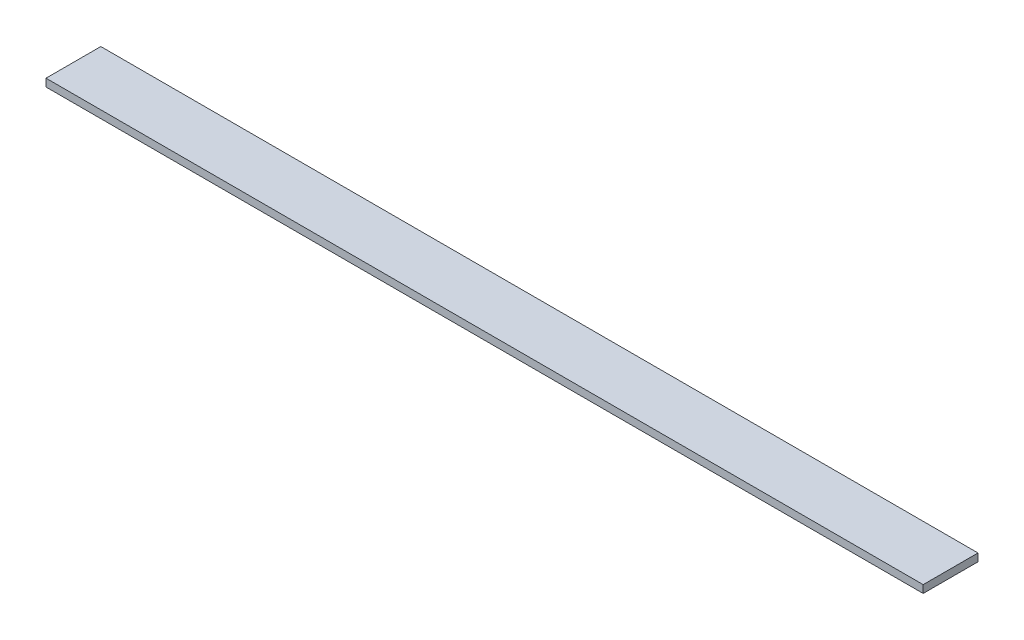
ISO-10303-21;
HEADER;
FILE_DESCRIPTION(('STEP AP214'),'2;1');
FILE_NAME('part.step','',(''),(''),'','','');
FILE_SCHEMA(('AUTOMOTIVE_DESIGN { 1 0 10303 214 1 1 1 1 }'));
ENDSEC;
DATA;
#1=APPLICATION_CONTEXT('core data for automotive mechanical design processes');
#2=APPLICATION_PROTOCOL_DEFINITION('international standard','automotive_design',2000,#1);
#3=PRODUCT_CONTEXT('',#1,'mechanical');
#4=PRODUCT('Part','Part','',(#3));
#5=PRODUCT_RELATED_PRODUCT_CATEGORY('part','',(#4));
#6=PRODUCT_DEFINITION_FORMATION('','',#4);
#7=PRODUCT_DEFINITION_CONTEXT('part definition',#1,'design');
#8=PRODUCT_DEFINITION('design','',#6,#7);
#9=PRODUCT_DEFINITION_SHAPE('','',#8);
#10=(LENGTH_UNIT() NAMED_UNIT(*) SI_UNIT(.MILLI.,.METRE.));
#11=(NAMED_UNIT(*) PLANE_ANGLE_UNIT() SI_UNIT($,.RADIAN.));
#12=(NAMED_UNIT(*) SI_UNIT($,.STERADIAN.) SOLID_ANGLE_UNIT());
#13=UNCERTAINTY_MEASURE_WITH_UNIT(LENGTH_MEASURE(1.E-05),#10,'distance_accuracy_value','');
#14=(GEOMETRIC_REPRESENTATION_CONTEXT(3) GLOBAL_UNCERTAINTY_ASSIGNED_CONTEXT((#13)) GLOBAL_UNIT_ASSIGNED_CONTEXT((#10,
#11,#12)) REPRESENTATION_CONTEXT('',''));
#15=CARTESIAN_POINT('',(0.,0.,0.));
#16=DIRECTION('',(0.,0.,1.));
#17=DIRECTION('',(1.,0.,0.));
#18=AXIS2_PLACEMENT_3D('',#15,#16,#17);
#19=CARTESIAN_POINT('',(40.,0.7,2.5));
#20=DIRECTION('',(-1.,0.,0.));
#21=DIRECTION('',(0.,0.,1.));
#22=AXIS2_PLACEMENT_3D('',#19,#20,#21);
#23=PLANE('',#22);
#24=DIRECTION('',(0.,0.,-1.));
#25=VECTOR('',#24,1.);
#26=CARTESIAN_POINT('',(40.,0.,2.5));
#27=LINE('',#26,#25);
#28=CARTESIAN_POINT('',(40.,0.,2.5));
#29=VERTEX_POINT('',#28);
#30=CARTESIAN_POINT('',(40.,0.,-2.5));
#31=VERTEX_POINT('',#30);
#32=EDGE_CURVE('E96',#29,#31,#27,.T.);
#33=ORIENTED_EDGE('',*,*,#32,.T.);
#34=DIRECTION('',(0.,-1.,0.));
#35=VECTOR('',#34,1.);
#36=CARTESIAN_POINT('',(40.,0.7,-2.5));
#37=LINE('',#36,#35);
#38=CARTESIAN_POINT('',(40.,0.7,-2.5));
#39=VERTEX_POINT('',#38);
#40=EDGE_CURVE('E11',#39,#31,#37,.T.);
#41=ORIENTED_EDGE('',*,*,#40,.F.);
#42=DIRECTION('',(0.,0.,-1.));
#43=VECTOR('',#42,1.);
#44=CARTESIAN_POINT('',(40.,0.7,2.5));
#45=LINE('',#44,#43);
#46=CARTESIAN_POINT('',(40.,0.7,2.5));
#47=VERTEX_POINT('',#46);
#48=EDGE_CURVE('E84',#47,#39,#45,.T.);
#49=ORIENTED_EDGE('',*,*,#48,.F.);
#50=DIRECTION('',(0.,-1.,0.));
#51=VECTOR('',#50,1.);
#52=CARTESIAN_POINT('',(40.,0.7,2.5));
#53=LINE('',#52,#51);
#54=EDGE_CURVE('E92',#47,#29,#53,.T.);
#55=ORIENTED_EDGE('',*,*,#54,.T.);
#56=EDGE_LOOP('',(#33,#41,#49,#55));
#57=FACE_BOUND('',#56,.T.);
#58=ADVANCED_FACE('F33',(#57),#23,.F.);
#59=CARTESIAN_POINT('',(-40.,0.7,-2.5));
#60=DIRECTION('',(0.,0.,1.));
#61=DIRECTION('',(1.,0.,0.));
#62=AXIS2_PLACEMENT_3D('',#59,#60,#61);
#63=PLANE('',#62);
#64=DIRECTION('',(-1.,0.,0.));
#65=VECTOR('',#64,1.);
#66=CARTESIAN_POINT('',(-40.,0.,-2.5));
#67=LINE('',#66,#65);
#68=CARTESIAN_POINT('',(-40.,0.,-2.5));
#69=VERTEX_POINT('',#68);
#70=EDGE_CURVE('E88',#31,#69,#67,.T.);
#71=ORIENTED_EDGE('',*,*,#70,.T.);
#72=DIRECTION('',(0.,-1.,0.));
#73=VECTOR('',#72,1.);
#74=CARTESIAN_POINT('',(-40.,0.7,-2.5));
#75=LINE('',#74,#73);
#76=CARTESIAN_POINT('',(-40.,0.7,-2.5));
#77=VERTEX_POINT('',#76);
#78=EDGE_CURVE('E41',#77,#69,#75,.T.);
#79=ORIENTED_EDGE('',*,*,#78,.F.);
#80=DIRECTION('',(-1.,0.,0.));
#81=VECTOR('',#80,1.);
#82=CARTESIAN_POINT('',(-40.,0.7,-2.5));
#83=LINE('',#82,#81);
#84=EDGE_CURVE('E79',#39,#77,#83,.T.);
#85=ORIENTED_EDGE('',*,*,#84,.F.);
#86=ORIENTED_EDGE('',*,*,#40,.T.);
#87=EDGE_LOOP('',(#71,#79,#85,#86));
#88=FACE_BOUND('',#87,.T.);
#89=ADVANCED_FACE('F87',(#88),#63,.F.);
#90=CARTESIAN_POINT('',(-40.,0.7,2.5));
#91=DIRECTION('',(1.,0.,0.));
#92=DIRECTION('',(0.,0.,-1.));
#93=AXIS2_PLACEMENT_3D('',#90,#91,#92);
#94=PLANE('',#93);
#95=DIRECTION('',(0.,0.,1.));
#96=VECTOR('',#95,1.);
#97=CARTESIAN_POINT('',(-40.,0.,2.5));
#98=LINE('',#97,#96);
#99=CARTESIAN_POINT('',(-40.,0.,2.5));
#100=VERTEX_POINT('',#99);
#101=EDGE_CURVE('E66',#69,#100,#98,.T.);
#102=ORIENTED_EDGE('',*,*,#101,.T.);
#103=DIRECTION('',(0.,-1.,0.));
#104=VECTOR('',#103,1.);
#105=CARTESIAN_POINT('',(-40.,0.7,2.5));
#106=LINE('',#105,#104);
#107=CARTESIAN_POINT('',(-40.,0.7,2.5));
#108=VERTEX_POINT('',#107);
#109=EDGE_CURVE('E89',#108,#100,#106,.T.);
#110=ORIENTED_EDGE('',*,*,#109,.F.);
#111=DIRECTION('',(0.,0.,1.));
#112=VECTOR('',#111,1.);
#113=CARTESIAN_POINT('',(-40.,0.7,2.5));
#114=LINE('',#113,#112);
#115=EDGE_CURVE('E82',#77,#108,#114,.T.);
#116=ORIENTED_EDGE('',*,*,#115,.F.);
#117=ORIENTED_EDGE('',*,*,#78,.T.);
#118=EDGE_LOOP('',(#102,#110,#116,#117));
#119=FACE_BOUND('',#118,.T.);
#120=ADVANCED_FACE('F90',(#119),#94,.F.);
#121=CARTESIAN_POINT('',(-40.,0.7,2.5));
#122=DIRECTION('',(0.,0.,-1.));
#123=DIRECTION('',(-1.,0.,0.));
#124=AXIS2_PLACEMENT_3D('',#121,#122,#123);
#125=PLANE('',#124);
#126=DIRECTION('',(1.,0.,0.));
#127=VECTOR('',#126,1.);
#128=CARTESIAN_POINT('',(-40.,0.,2.5));
#129=LINE('',#128,#127);
#130=EDGE_CURVE('E72',#100,#29,#129,.T.);
#131=ORIENTED_EDGE('',*,*,#130,.T.);
#132=ORIENTED_EDGE('',*,*,#54,.F.);
#133=DIRECTION('',(1.,0.,0.));
#134=VECTOR('',#133,1.);
#135=CARTESIAN_POINT('',(-40.,0.7,2.5));
#136=LINE('',#135,#134);
#137=EDGE_CURVE('E49',#108,#47,#136,.T.);
#138=ORIENTED_EDGE('',*,*,#137,.F.);
#139=ORIENTED_EDGE('',*,*,#109,.T.);
#140=EDGE_LOOP('',(#131,#132,#138,#139));
#141=FACE_BOUND('',#140,.T.);
#142=ADVANCED_FACE('F103',(#141),#125,.F.);
#143=CARTESIAN_POINT('',(0.,0.7,0.));
#144=DIRECTION('',(0.,-1.,0.));
#145=DIRECTION('',(0.,0.,-1.));
#146=AXIS2_PLACEMENT_3D('',#143,#144,#145);
#147=PLANE('',#146);
#148=ORIENTED_EDGE('',*,*,#48,.T.);
#149=ORIENTED_EDGE('',*,*,#84,.T.);
#150=ORIENTED_EDGE('',*,*,#115,.T.);
#151=ORIENTED_EDGE('',*,*,#137,.T.);
#152=EDGE_LOOP('',(#148,#149,#150,#151));
#153=FACE_BOUND('',#152,.T.);
#154=ADVANCED_FACE('F80',(#153),#147,.F.);
#155=CARTESIAN_POINT('',(0.,0.,0.));
#156=DIRECTION('',(0.,-1.,0.));
#157=DIRECTION('',(0.,0.,-1.));
#158=AXIS2_PLACEMENT_3D('',#155,#156,#157);
#159=PLANE('',#158);
#160=ORIENTED_EDGE('',*,*,#32,.F.);
#161=ORIENTED_EDGE('',*,*,#130,.F.);
#162=ORIENTED_EDGE('',*,*,#101,.F.);
#163=ORIENTED_EDGE('',*,*,#70,.F.);
#164=EDGE_LOOP('',(#160,#161,#162,#163));
#165=FACE_BOUND('',#164,.T.);
#166=ADVANCED_FACE('F106',(#165),#159,.T.);
#167=CLOSED_SHELL('',(#58,#89,#120,#142,#154,#166));
#168=MANIFOLD_SOLID_BREP('B2',#167);
#169=ADVANCED_BREP_SHAPE_REPRESENTATION('',(#18,#168),#14);
#170=SHAPE_DEFINITION_REPRESENTATION(#9,#169);
ENDSEC;
END-ISO-10303-21;
